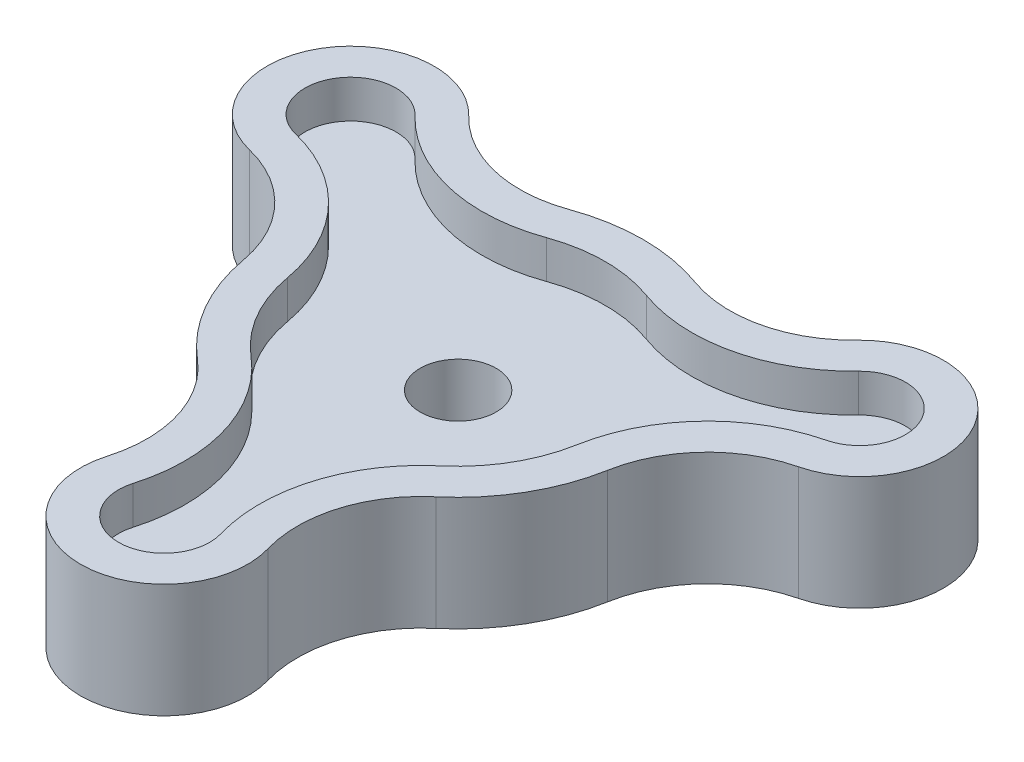
ISO-10303-21;
HEADER;
FILE_DESCRIPTION(('STEP AP214'),'2;1');
FILE_NAME('part.step','',(''),(''),'','','');
FILE_SCHEMA(('AUTOMOTIVE_DESIGN { 1 0 10303 214 1 1 1 1 }'));
ENDSEC;
DATA;
#1=APPLICATION_CONTEXT('core data for automotive mechanical design processes');
#2=APPLICATION_PROTOCOL_DEFINITION('international standard','automotive_design',2000,#1);
#3=PRODUCT_CONTEXT('',#1,'mechanical');
#4=PRODUCT('Part','Part','',(#3));
#5=PRODUCT_RELATED_PRODUCT_CATEGORY('part','',(#4));
#6=PRODUCT_DEFINITION_FORMATION('','',#4);
#7=PRODUCT_DEFINITION_CONTEXT('part definition',#1,'design');
#8=PRODUCT_DEFINITION('design','',#6,#7);
#9=PRODUCT_DEFINITION_SHAPE('','',#8);
#10=(LENGTH_UNIT() NAMED_UNIT(*) SI_UNIT(.MILLI.,.METRE.));
#11=(NAMED_UNIT(*) PLANE_ANGLE_UNIT() SI_UNIT($,.RADIAN.));
#12=(NAMED_UNIT(*) SI_UNIT($,.STERADIAN.) SOLID_ANGLE_UNIT());
#13=UNCERTAINTY_MEASURE_WITH_UNIT(LENGTH_MEASURE(1.E-05),#10,'distance_accuracy_value','');
#14=(GEOMETRIC_REPRESENTATION_CONTEXT(3) GLOBAL_UNCERTAINTY_ASSIGNED_CONTEXT((#13)) GLOBAL_UNIT_ASSIGNED_CONTEXT((#10,
#11,#12)) REPRESENTATION_CONTEXT('',''));
#15=CARTESIAN_POINT('',(0.,0.,0.));
#16=DIRECTION('',(0.,0.,1.));
#17=DIRECTION('',(1.,0.,0.));
#18=AXIS2_PLACEMENT_3D('',#15,#16,#17);
#19=CARTESIAN_POINT('',(0.,9.525,0.));
#20=DIRECTION('',(0.,1.,0.));
#21=DIRECTION('',(0.,0.,1.));
#22=AXIS2_PLACEMENT_3D('',#19,#20,#21);
#23=PLANE('',#22);
#24=CARTESIAN_POINT('',(28.575,9.525,46.9975254020045));
#25=DIRECTION('',(0.,1.,0.));
#26=DIRECTION('',(0.,0.,1.));
#27=AXIS2_PLACEMENT_3D('',#24,#25,#26);
#28=CIRCLE('',#27,3.81);
#29=CARTESIAN_POINT('',(24.9172400250551,9.525,45.9312740406028));
#30=VERTEX_POINT('',#29);
#31=CARTESIAN_POINT('',(32.2327599749449,9.525,45.9312740406028));
#32=VERTEX_POINT('',#31);
#33=EDGE_CURVE('E295',#30,#32,#28,.T.);
#34=ORIENTED_EDGE('',*,*,#33,.F.);
#35=CARTESIAN_POINT('',(11.9468231539004,9.525,42.1503467130723));
#36=DIRECTION('',(0.,1.,0.));
#37=DIRECTION('',(0.,0.,1.));
#38=AXIS2_PLACEMENT_3D('',#35,#36,#37);
#39=CIRCLE('',#38,13.51026);
#40=CARTESIAN_POINT('',(20.6569458181399,9.525,31.8226708640973));
#41=VERTEX_POINT('',#40);
#42=EDGE_CURVE('E247',#30,#41,#39,.T.);
#43=ORIENTED_EDGE('',*,*,#42,.T.);
#44=CARTESIAN_POINT('',(28.575,9.525,22.4341581993318));
#45=DIRECTION('',(0.,1.,0.));
#46=DIRECTION('',(0.,0.,1.));
#47=AXIS2_PLACEMENT_3D('',#44,#45,#46);
#48=CIRCLE('',#47,12.2816836013363);
#49=CARTESIAN_POINT('',(16.4852824376311,9.525,24.5971379369816));
#50=VERTEX_POINT('',#49);
#51=EDGE_CURVE('E269',#50,#41,#48,.T.);
#52=ORIENTED_EDGE('',*,*,#51,.F.);
#53=CARTESIAN_POINT('',(3.18619145824801,9.525,26.976487509804));
#54=DIRECTION('',(0.,1.,0.));
#55=DIRECTION('',(0.,0.,1.));
#56=AXIS2_PLACEMENT_3D('',#53,#54,#55);
#57=CIRCLE('',#56,13.51026);
#58=CARTESIAN_POINT('',(6.39702077832116,9.525,13.8533133379446));
#59=VERTEX_POINT('',#58);
#60=EDGE_CURVE('E320',#50,#59,#57,.T.);
#61=ORIENTED_EDGE('',*,*,#60,.T.);
#62=CARTESIAN_POINT('',(7.3025,9.525,10.1524745979955));
#63=DIRECTION('',(0.,1.,0.));
#64=DIRECTION('',(0.,0.,1.));
#65=AXIS2_PLACEMENT_3D('',#62,#63,#64);
#66=CIRCLE('',#65,3.81);
#67=CARTESIAN_POINT('',(10.0547807532661,9.525,7.51788721944815));
#68=VERTEX_POINT('',#67);
#69=EDGE_CURVE('E317',#68,#59,#66,.T.);
#70=ORIENTED_EDGE('',*,*,#69,.F.);
#71=CARTESIAN_POINT('',(19.8143683043476,9.525,-1.82435962488083));
#72=DIRECTION('',(0.,1.,0.));
#73=DIRECTION('',(0.,0.,1.));
#74=AXIS2_PLACEMENT_3D('',#71,#72,#73);
#75=CIRCLE('',#74,13.51026);
#76=CARTESIAN_POINT('',(24.4033366194913,9.525,10.8826657969167));
#77=VERTEX_POINT('',#76);
#78=EDGE_CURVE('E314',#68,#77,#75,.T.);
#79=ORIENTED_EDGE('',*,*,#78,.T.);
#80=CARTESIAN_POINT('',(32.7466633805087,9.525,10.8826657969166));
#81=VERTEX_POINT('',#80);
#82=EDGE_CURVE('E305',#81,#77,#48,.T.);
#83=ORIENTED_EDGE('',*,*,#82,.F.);
#84=CARTESIAN_POINT('',(37.3356316956524,9.525,-1.82435962488083));
#85=DIRECTION('',(0.,1.,0.));
#86=DIRECTION('',(0.,0.,1.));
#87=AXIS2_PLACEMENT_3D('',#84,#85,#86);
#88=CIRCLE('',#87,13.51026);
#89=CARTESIAN_POINT('',(47.0952192467339,9.525,7.51788721944815));
#90=VERTEX_POINT('',#89);
#91=EDGE_CURVE('E311',#81,#90,#88,.T.);
#92=ORIENTED_EDGE('',*,*,#91,.T.);
#93=CARTESIAN_POINT('',(49.8475,9.525,10.1524745979955));
#94=DIRECTION('',(0.,1.,0.));
#95=DIRECTION('',(0.,0.,1.));
#96=AXIS2_PLACEMENT_3D('',#93,#94,#95);
#97=CIRCLE('',#96,3.81);
#98=CARTESIAN_POINT('',(50.7529792216788,9.525,13.8533133379446));
#99=VERTEX_POINT('',#98);
#100=EDGE_CURVE('E308',#99,#90,#97,.T.);
#101=ORIENTED_EDGE('',*,*,#100,.F.);
#102=CARTESIAN_POINT('',(53.963808541752,9.525,26.976487509804));
#103=DIRECTION('',(0.,1.,0.));
#104=DIRECTION('',(0.,0.,1.));
#105=AXIS2_PLACEMENT_3D('',#102,#103,#104);
#106=CIRCLE('',#105,13.51026);
#107=CARTESIAN_POINT('',(40.6647175623689,9.525,24.5971379369816));
#108=VERTEX_POINT('',#107);
#109=EDGE_CURVE('E304',#99,#108,#106,.T.);
#110=ORIENTED_EDGE('',*,*,#109,.T.);
#111=CARTESIAN_POINT('',(36.4930541818601,9.525,31.8226708640973));
#112=VERTEX_POINT('',#111);
#113=EDGE_CURVE('E301',#112,#108,#48,.T.);
#114=ORIENTED_EDGE('',*,*,#113,.F.);
#115=CARTESIAN_POINT('',(45.2031768460996,9.525,42.1503467130723));
#116=DIRECTION('',(0.,1.,0.));
#117=DIRECTION('',(0.,0.,1.));
#118=AXIS2_PLACEMENT_3D('',#115,#116,#117);
#119=CIRCLE('',#118,13.51026);
#120=EDGE_CURVE('E298',#112,#32,#119,.T.);
#121=ORIENTED_EDGE('',*,*,#120,.T.);
#122=EDGE_LOOP('',(#34,#43,#52,#61,#70,#79,#83,#92,#101,#110,#114,#121));
#123=FACE_BOUND('',#122,.T.);
#124=CARTESIAN_POINT('',(19.8143683043476,9.525,-1.82435962488083));
#125=DIRECTION('',(0.,1.,0.));
#126=DIRECTION('',(0.,0.,1.));
#127=AXIS2_PLACEMENT_3D('',#124,#125,#126);
#128=CIRCLE('',#127,10.33526);
#129=CARTESIAN_POINT('',(12.3483480476545,9.525,5.32239773732534));
#130=VERTEX_POINT('',#129);
#131=CARTESIAN_POINT('',(23.3248988691755,9.525,7.89643120822576));
#132=VERTEX_POINT('',#131);
#133=EDGE_CURVE('E211',#130,#132,#128,.T.);
#134=ORIENTED_EDGE('',*,*,#133,.F.);
#135=CARTESIAN_POINT('',(7.3025,9.525,10.1524745979955));
#136=DIRECTION('',(0.,1.,0.));
#137=DIRECTION('',(0.,0.,1.));
#138=AXIS2_PLACEMENT_3D('',#135,#136,#137);
#139=CIRCLE('',#138,6.985);
#140=CARTESIAN_POINT('',(5.64245476025546,9.525,16.9373456212355));
#141=VERTEX_POINT('',#140);
#142=EDGE_CURVE('E54',#130,#141,#139,.T.);
#143=ORIENTED_EDGE('',*,*,#142,.T.);
#144=CARTESIAN_POINT('',(3.18619145824801,9.525,26.976487509804));
#145=DIRECTION('',(0.,1.,0.));
#146=DIRECTION('',(0.,0.,1.));
#147=AXIS2_PLACEMENT_3D('',#144,#145,#146);
#148=CIRCLE('',#147,10.33526);
#149=CARTESIAN_POINT('',(13.3599085470072,9.525,25.1563007431534));
#150=VERTEX_POINT('',#149);
#151=EDGE_CURVE('E242',#150,#141,#148,.T.);
#152=ORIENTED_EDGE('',*,*,#151,.F.);
#153=CARTESIAN_POINT('',(28.575,9.525,22.4341581993318));
#154=DIRECTION('',(0.,1.,0.));
#155=DIRECTION('',(0.,0.,1.));
#156=AXIS2_PLACEMENT_3D('',#153,#154,#155);
#157=CIRCLE('',#156,15.4566836013363);
#158=CARTESIAN_POINT('',(18.6100096778317,9.525,34.2497426466163));
#159=VERTEX_POINT('',#158);
#160=EDGE_CURVE('E239',#150,#159,#157,.T.);
#161=ORIENTED_EDGE('',*,*,#160,.T.);
#162=CARTESIAN_POINT('',(11.9468231539004,9.525,42.1503467130723));
#163=DIRECTION('',(0.,1.,0.));
#164=DIRECTION('',(0.,0.,1.));
#165=AXIS2_PLACEMENT_3D('',#162,#163,#164);
#166=CIRCLE('',#165,10.33526);
#167=CARTESIAN_POINT('',(21.869106712601,9.525,45.0427312394347));
#168=VERTEX_POINT('',#167);
#169=EDGE_CURVE('E236',#168,#159,#166,.T.);
#170=ORIENTED_EDGE('',*,*,#169,.F.);
#171=CARTESIAN_POINT('',(28.575,9.525,46.9975254020045));
#172=DIRECTION('',(0.,1.,0.));
#173=DIRECTION('',(0.,0.,1.));
#174=AXIS2_PLACEMENT_3D('',#171,#172,#173);
#175=CIRCLE('',#174,6.985);
#176=CARTESIAN_POINT('',(35.280893287399,9.525,45.0427312394347));
#177=VERTEX_POINT('',#176);
#178=EDGE_CURVE('E233',#168,#177,#175,.T.);
#179=ORIENTED_EDGE('',*,*,#178,.T.);
#180=CARTESIAN_POINT('',(45.2031768460996,9.525,42.1503467130723));
#181=DIRECTION('',(0.,1.,0.));
#182=DIRECTION('',(0.,0.,1.));
#183=AXIS2_PLACEMENT_3D('',#180,#181,#182);
#184=CIRCLE('',#183,10.33526);
#185=CARTESIAN_POINT('',(38.5399903221683,9.525,34.2497426466163));
#186=VERTEX_POINT('',#185);
#187=EDGE_CURVE('E230',#186,#177,#184,.T.);
#188=ORIENTED_EDGE('',*,*,#187,.F.);
#189=CARTESIAN_POINT('',(28.575,9.525,22.4341581993318));
#190=DIRECTION('',(0.,1.,0.));
#191=DIRECTION('',(0.,0.,1.));
#192=AXIS2_PLACEMENT_3D('',#189,#190,#191);
#193=CIRCLE('',#192,15.4566836013363);
#194=CARTESIAN_POINT('',(43.7900914529928,9.525,25.1563007431534));
#195=VERTEX_POINT('',#194);
#196=EDGE_CURVE('E227',#186,#195,#193,.T.);
#197=ORIENTED_EDGE('',*,*,#196,.T.);
#198=CARTESIAN_POINT('',(53.963808541752,9.525,26.976487509804));
#199=DIRECTION('',(0.,1.,0.));
#200=DIRECTION('',(0.,0.,1.));
#201=AXIS2_PLACEMENT_3D('',#198,#199,#200);
#202=CIRCLE('',#201,10.33526);
#203=CARTESIAN_POINT('',(51.5075452397445,9.525,16.9373456212355));
#204=VERTEX_POINT('',#203);
#205=EDGE_CURVE('E224',#204,#195,#202,.T.);
#206=ORIENTED_EDGE('',*,*,#205,.F.);
#207=CARTESIAN_POINT('',(49.8475,9.525,10.1524745979955));
#208=DIRECTION('',(0.,1.,0.));
#209=DIRECTION('',(0.,0.,1.));
#210=AXIS2_PLACEMENT_3D('',#207,#208,#209);
#211=CIRCLE('',#210,6.985);
#212=CARTESIAN_POINT('',(44.8016519523455,9.525,5.32239773732534));
#213=VERTEX_POINT('',#212);
#214=EDGE_CURVE('E219',#204,#213,#211,.T.);
#215=ORIENTED_EDGE('',*,*,#214,.T.);
#216=CARTESIAN_POINT('',(37.3356316956524,9.525,-1.82435962488083));
#217=DIRECTION('',(0.,1.,0.));
#218=DIRECTION('',(0.,0.,1.));
#219=AXIS2_PLACEMENT_3D('',#216,#217,#218);
#220=CIRCLE('',#219,10.33526);
#221=CARTESIAN_POINT('',(33.8251011308245,9.525,7.89643120822576));
#222=VERTEX_POINT('',#221);
#223=EDGE_CURVE('E217',#222,#213,#220,.T.);
#224=ORIENTED_EDGE('',*,*,#223,.F.);
#225=CARTESIAN_POINT('',(28.575,9.525,22.4341581993318));
#226=DIRECTION('',(0.,1.,0.));
#227=DIRECTION('',(0.,0.,1.));
#228=AXIS2_PLACEMENT_3D('',#225,#226,#227);
#229=CIRCLE('',#228,15.4566836013363);
#230=EDGE_CURVE('E202',#222,#132,#229,.T.);
#231=ORIENTED_EDGE('',*,*,#230,.T.);
#232=EDGE_LOOP('',(#134,#143,#152,#161,#170,#179,#188,#197,#206,#215,#224,#231));
#233=FACE_BOUND('',#232,.T.);
#234=ADVANCED_FACE('F39',(#123,#233),#23,.T.);
#235=CARTESIAN_POINT('',(11.9468231539004,6.35,42.1503467130723));
#236=DIRECTION('',(0.,1.,0.));
#237=DIRECTION('',(0.,0.,1.));
#238=AXIS2_PLACEMENT_3D('',#235,#236,#237);
#239=CYLINDRICAL_SURFACE('',#238,13.51026);
#240=ORIENTED_EDGE('',*,*,#42,.F.);
#241=DIRECTION('',(0.,1.,0.));
#242=VECTOR('',#241,1.);
#243=CARTESIAN_POINT('',(24.9172400250551,6.35,45.9312740406028));
#244=LINE('',#243,#242);
#245=CARTESIAN_POINT('',(24.9172400250551,6.35,45.9312740406028));
#246=VERTEX_POINT('',#245);
#247=EDGE_CURVE('E346',#246,#30,#244,.T.);
#248=ORIENTED_EDGE('',*,*,#247,.F.);
#249=CARTESIAN_POINT('',(11.9468231539004,6.35,42.1503467130723));
#250=DIRECTION('',(0.,1.,0.));
#251=DIRECTION('',(0.,0.,1.));
#252=AXIS2_PLACEMENT_3D('',#249,#250,#251);
#253=CIRCLE('',#252,13.51026);
#254=CARTESIAN_POINT('',(20.6569458181399,6.35,31.8226708640973));
#255=VERTEX_POINT('',#254);
#256=EDGE_CURVE('E266',#246,#255,#253,.T.);
#257=ORIENTED_EDGE('',*,*,#256,.T.);
#258=DIRECTION('',(0.,1.,0.));
#259=VECTOR('',#258,1.);
#260=CARTESIAN_POINT('',(20.6569458181399,6.35,31.8226708640973));
#261=LINE('',#260,#259);
#262=EDGE_CURVE('E323',#255,#41,#261,.T.);
#263=ORIENTED_EDGE('',*,*,#262,.T.);
#264=EDGE_LOOP('',(#240,#248,#257,#263));
#265=FACE_BOUND('',#264,.T.);
#266=ADVANCED_FACE('F455',(#265),#239,.T.);
#267=CARTESIAN_POINT('',(28.575,6.35,22.4341581993318));
#268=DIRECTION('',(0.,1.,0.));
#269=DIRECTION('',(0.,0.,1.));
#270=AXIS2_PLACEMENT_3D('',#267,#268,#269);
#271=CYLINDRICAL_SURFACE('',#270,12.2816836013363);
#272=ORIENTED_EDGE('',*,*,#51,.T.);
#273=ORIENTED_EDGE('',*,*,#262,.F.);
#274=CARTESIAN_POINT('',(28.575,6.35,22.4341581993318));
#275=DIRECTION('',(0.,1.,0.));
#276=DIRECTION('',(0.,0.,1.));
#277=AXIS2_PLACEMENT_3D('',#274,#275,#276);
#278=CIRCLE('',#277,12.2816836013363);
#279=CARTESIAN_POINT('',(16.4852824376311,6.35,24.5971379369816));
#280=VERTEX_POINT('',#279);
#281=EDGE_CURVE('E278',#280,#255,#278,.T.);
#282=ORIENTED_EDGE('',*,*,#281,.F.);
#283=DIRECTION('',(0.,1.,0.));
#284=VECTOR('',#283,1.);
#285=CARTESIAN_POINT('',(16.4852824376311,6.35,24.5971379369816));
#286=LINE('',#285,#284);
#287=EDGE_CURVE('E326',#280,#50,#286,.T.);
#288=ORIENTED_EDGE('',*,*,#287,.T.);
#289=EDGE_LOOP('',(#272,#273,#282,#288));
#290=FACE_BOUND('',#289,.T.);
#291=ADVANCED_FACE('F454',(#290),#271,.F.);
#292=CARTESIAN_POINT('',(3.18619145824801,6.35,26.976487509804));
#293=DIRECTION('',(0.,1.,0.));
#294=DIRECTION('',(0.,0.,1.));
#295=AXIS2_PLACEMENT_3D('',#292,#293,#294);
#296=CYLINDRICAL_SURFACE('',#295,13.51026);
#297=ORIENTED_EDGE('',*,*,#60,.F.);
#298=ORIENTED_EDGE('',*,*,#287,.F.);
#299=CARTESIAN_POINT('',(3.18619145824801,6.35,26.976487509804));
#300=DIRECTION('',(0.,1.,0.));
#301=DIRECTION('',(0.,0.,1.));
#302=AXIS2_PLACEMENT_3D('',#299,#300,#301);
#303=CIRCLE('',#302,13.51026);
#304=CARTESIAN_POINT('',(6.39702077832116,6.35,13.8533133379446));
#305=VERTEX_POINT('',#304);
#306=EDGE_CURVE('E291',#280,#305,#303,.T.);
#307=ORIENTED_EDGE('',*,*,#306,.T.);
#308=DIRECTION('',(0.,1.,0.));
#309=VECTOR('',#308,1.);
#310=CARTESIAN_POINT('',(6.39702077832116,6.35,13.8533133379446));
#311=LINE('',#310,#309);
#312=EDGE_CURVE('E328',#305,#59,#311,.T.);
#313=ORIENTED_EDGE('',*,*,#312,.T.);
#314=EDGE_LOOP('',(#297,#298,#307,#313));
#315=FACE_BOUND('',#314,.T.);
#316=ADVANCED_FACE('F450',(#315),#296,.T.);
#317=CARTESIAN_POINT('',(7.3025,6.35,10.1524745979955));
#318=DIRECTION('',(0.,1.,0.));
#319=DIRECTION('',(0.,0.,1.));
#320=AXIS2_PLACEMENT_3D('',#317,#318,#319);
#321=CYLINDRICAL_SURFACE('',#320,3.81);
#322=ORIENTED_EDGE('',*,*,#69,.T.);
#323=ORIENTED_EDGE('',*,*,#312,.F.);
#324=CARTESIAN_POINT('',(7.3025,6.35,10.1524745979955));
#325=DIRECTION('',(0.,1.,0.));
#326=DIRECTION('',(0.,0.,1.));
#327=AXIS2_PLACEMENT_3D('',#324,#325,#326);
#328=CIRCLE('',#327,3.81);
#329=CARTESIAN_POINT('',(10.0547807532661,6.35,7.51788721944815));
#330=VERTEX_POINT('',#329);
#331=EDGE_CURVE('E288',#330,#305,#328,.T.);
#332=ORIENTED_EDGE('',*,*,#331,.F.);
#333=DIRECTION('',(0.,1.,0.));
#334=VECTOR('',#333,1.);
#335=CARTESIAN_POINT('',(10.0547807532661,6.35,7.51788721944815));
#336=LINE('',#335,#334);
#337=EDGE_CURVE('E330',#330,#68,#336,.T.);
#338=ORIENTED_EDGE('',*,*,#337,.T.);
#339=EDGE_LOOP('',(#322,#323,#332,#338));
#340=FACE_BOUND('',#339,.T.);
#341=ADVANCED_FACE('F447',(#340),#321,.F.);
#342=CARTESIAN_POINT('',(19.8143683043476,6.35,-1.82435962488083));
#343=DIRECTION('',(0.,1.,0.));
#344=DIRECTION('',(0.,0.,1.));
#345=AXIS2_PLACEMENT_3D('',#342,#343,#344);
#346=CYLINDRICAL_SURFACE('',#345,13.51026);
#347=ORIENTED_EDGE('',*,*,#78,.F.);
#348=ORIENTED_EDGE('',*,*,#337,.F.);
#349=CARTESIAN_POINT('',(19.8143683043476,6.35,-1.82435962488083));
#350=DIRECTION('',(0.,1.,0.));
#351=DIRECTION('',(0.,0.,1.));
#352=AXIS2_PLACEMENT_3D('',#349,#350,#351);
#353=CIRCLE('',#352,13.51026);
#354=CARTESIAN_POINT('',(24.4033366194913,6.35,10.8826657969167));
#355=VERTEX_POINT('',#354);
#356=EDGE_CURVE('E286',#330,#355,#353,.T.);
#357=ORIENTED_EDGE('',*,*,#356,.T.);
#358=DIRECTION('',(0.,1.,0.));
#359=VECTOR('',#358,1.);
#360=CARTESIAN_POINT('',(24.4033366194913,6.35,10.8826657969167));
#361=LINE('',#360,#359);
#362=EDGE_CURVE('E332',#355,#77,#361,.T.);
#363=ORIENTED_EDGE('',*,*,#362,.T.);
#364=EDGE_LOOP('',(#347,#348,#357,#363));
#365=FACE_BOUND('',#364,.T.);
#366=ADVANCED_FACE('F442',(#365),#346,.T.);
#367=ORIENTED_EDGE('',*,*,#82,.T.);
#368=ORIENTED_EDGE('',*,*,#362,.F.);
#369=CARTESIAN_POINT('',(32.7466633805087,6.35,10.8826657969166));
#370=VERTEX_POINT('',#369);
#371=EDGE_CURVE('E279',#370,#355,#278,.T.);
#372=ORIENTED_EDGE('',*,*,#371,.F.);
#373=DIRECTION('',(0.,1.,0.));
#374=VECTOR('',#373,1.);
#375=CARTESIAN_POINT('',(32.7466633805087,6.35,10.8826657969166));
#376=LINE('',#375,#374);
#377=EDGE_CURVE('E334',#370,#81,#376,.T.);
#378=ORIENTED_EDGE('',*,*,#377,.T.);
#379=EDGE_LOOP('',(#367,#368,#372,#378));
#380=FACE_BOUND('',#379,.T.);
#381=ADVANCED_FACE('F439',(#380),#271,.F.);
#382=CARTESIAN_POINT('',(37.3356316956524,6.35,-1.82435962488083));
#383=DIRECTION('',(0.,1.,0.));
#384=DIRECTION('',(0.,0.,1.));
#385=AXIS2_PLACEMENT_3D('',#382,#383,#384);
#386=CYLINDRICAL_SURFACE('',#385,13.51026);
#387=ORIENTED_EDGE('',*,*,#91,.F.);
#388=ORIENTED_EDGE('',*,*,#377,.F.);
#389=CARTESIAN_POINT('',(37.3356316956524,6.35,-1.82435962488083));
#390=DIRECTION('',(0.,1.,0.));
#391=DIRECTION('',(0.,0.,1.));
#392=AXIS2_PLACEMENT_3D('',#389,#390,#391);
#393=CIRCLE('',#392,13.51026);
#394=CARTESIAN_POINT('',(47.0952192467339,6.35,7.51788721944815));
#395=VERTEX_POINT('',#394);
#396=EDGE_CURVE('E284',#370,#395,#393,.T.);
#397=ORIENTED_EDGE('',*,*,#396,.T.);
#398=DIRECTION('',(0.,1.,0.));
#399=VECTOR('',#398,1.);
#400=CARTESIAN_POINT('',(47.0952192467339,6.35,7.51788721944815));
#401=LINE('',#400,#399);
#402=EDGE_CURVE('E336',#395,#90,#401,.T.);
#403=ORIENTED_EDGE('',*,*,#402,.T.);
#404=EDGE_LOOP('',(#387,#388,#397,#403));
#405=FACE_BOUND('',#404,.T.);
#406=ADVANCED_FACE('F431',(#405),#386,.T.);
#407=CARTESIAN_POINT('',(49.8475,6.35,10.1524745979955));
#408=DIRECTION('',(0.,1.,0.));
#409=DIRECTION('',(0.,0.,1.));
#410=AXIS2_PLACEMENT_3D('',#407,#408,#409);
#411=CYLINDRICAL_SURFACE('',#410,3.81);
#412=ORIENTED_EDGE('',*,*,#100,.T.);
#413=ORIENTED_EDGE('',*,*,#402,.F.);
#414=CARTESIAN_POINT('',(49.8475,6.35,10.1524745979955));
#415=DIRECTION('',(0.,1.,0.));
#416=DIRECTION('',(0.,0.,1.));
#417=AXIS2_PLACEMENT_3D('',#414,#415,#416);
#418=CIRCLE('',#417,3.81);
#419=CARTESIAN_POINT('',(50.7529792216788,6.35,13.8533133379446));
#420=VERTEX_POINT('',#419);
#421=EDGE_CURVE('E281',#420,#395,#418,.T.);
#422=ORIENTED_EDGE('',*,*,#421,.F.);
#423=DIRECTION('',(0.,1.,0.));
#424=VECTOR('',#423,1.);
#425=CARTESIAN_POINT('',(50.7529792216788,6.35,13.8533133379446));
#426=LINE('',#425,#424);
#427=EDGE_CURVE('E338',#420,#99,#426,.T.);
#428=ORIENTED_EDGE('',*,*,#427,.T.);
#429=EDGE_LOOP('',(#412,#413,#422,#428));
#430=FACE_BOUND('',#429,.T.);
#431=ADVANCED_FACE('F428',(#430),#411,.F.);
#432=CARTESIAN_POINT('',(53.963808541752,6.35,26.976487509804));
#433=DIRECTION('',(0.,1.,0.));
#434=DIRECTION('',(0.,0.,1.));
#435=AXIS2_PLACEMENT_3D('',#432,#433,#434);
#436=CYLINDRICAL_SURFACE('',#435,13.51026);
#437=ORIENTED_EDGE('',*,*,#109,.F.);
#438=ORIENTED_EDGE('',*,*,#427,.F.);
#439=CARTESIAN_POINT('',(53.963808541752,6.35,26.976487509804));
#440=DIRECTION('',(0.,1.,0.));
#441=DIRECTION('',(0.,0.,1.));
#442=AXIS2_PLACEMENT_3D('',#439,#440,#441);
#443=CIRCLE('',#442,13.51026);
#444=CARTESIAN_POINT('',(40.6647175623689,6.35,24.5971379369816));
#445=VERTEX_POINT('',#444);
#446=EDGE_CURVE('E277',#420,#445,#443,.T.);
#447=ORIENTED_EDGE('',*,*,#446,.T.);
#448=DIRECTION('',(0.,1.,0.));
#449=VECTOR('',#448,1.);
#450=CARTESIAN_POINT('',(40.6647175623689,6.35,24.5971379369816));
#451=LINE('',#450,#449);
#452=EDGE_CURVE('E340',#445,#108,#451,.T.);
#453=ORIENTED_EDGE('',*,*,#452,.T.);
#454=EDGE_LOOP('',(#437,#438,#447,#453));
#455=FACE_BOUND('',#454,.T.);
#456=ADVANCED_FACE('F422',(#455),#436,.T.);
#457=ORIENTED_EDGE('',*,*,#113,.T.);
#458=ORIENTED_EDGE('',*,*,#452,.F.);
#459=CARTESIAN_POINT('',(36.4930541818601,6.35,31.8226708640973));
#460=VERTEX_POINT('',#459);
#461=EDGE_CURVE('E274',#460,#445,#278,.T.);
#462=ORIENTED_EDGE('',*,*,#461,.F.);
#463=DIRECTION('',(0.,1.,0.));
#464=VECTOR('',#463,1.);
#465=CARTESIAN_POINT('',(36.4930541818601,6.35,31.8226708640973));
#466=LINE('',#465,#464);
#467=EDGE_CURVE('E342',#460,#112,#466,.T.);
#468=ORIENTED_EDGE('',*,*,#467,.T.);
#469=EDGE_LOOP('',(#457,#458,#462,#468));
#470=FACE_BOUND('',#469,.T.);
#471=ADVANCED_FACE('F419',(#470),#271,.F.);
#472=CARTESIAN_POINT('',(45.2031768460996,6.35,42.1503467130723));
#473=DIRECTION('',(0.,1.,0.));
#474=DIRECTION('',(0.,0.,1.));
#475=AXIS2_PLACEMENT_3D('',#472,#473,#474);
#476=CYLINDRICAL_SURFACE('',#475,13.51026);
#477=ORIENTED_EDGE('',*,*,#120,.F.);
#478=ORIENTED_EDGE('',*,*,#467,.F.);
#479=CARTESIAN_POINT('',(45.2031768460996,6.35,42.1503467130723));
#480=DIRECTION('',(0.,1.,0.));
#481=DIRECTION('',(0.,0.,1.));
#482=AXIS2_PLACEMENT_3D('',#479,#480,#481);
#483=CIRCLE('',#482,13.51026);
#484=CARTESIAN_POINT('',(32.2327599749449,6.35,45.9312740406028));
#485=VERTEX_POINT('',#484);
#486=EDGE_CURVE('E272',#460,#485,#483,.T.);
#487=ORIENTED_EDGE('',*,*,#486,.T.);
#488=DIRECTION('',(0.,1.,0.));
#489=VECTOR('',#488,1.);
#490=CARTESIAN_POINT('',(32.2327599749449,6.35,45.9312740406028));
#491=LINE('',#490,#489);
#492=EDGE_CURVE('E344',#485,#32,#491,.T.);
#493=ORIENTED_EDGE('',*,*,#492,.T.);
#494=EDGE_LOOP('',(#477,#478,#487,#493));
#495=FACE_BOUND('',#494,.T.);
#496=ADVANCED_FACE('F413',(#495),#476,.T.);
#497=CARTESIAN_POINT('',(28.575,6.35,46.9975254020045));
#498=DIRECTION('',(0.,1.,0.));
#499=DIRECTION('',(0.,0.,1.));
#500=AXIS2_PLACEMENT_3D('',#497,#498,#499);
#501=CYLINDRICAL_SURFACE('',#500,3.81);
#502=ORIENTED_EDGE('',*,*,#33,.T.);
#503=ORIENTED_EDGE('',*,*,#492,.F.);
#504=CARTESIAN_POINT('',(28.575,6.35,46.9975254020045));
#505=DIRECTION('',(0.,1.,0.));
#506=DIRECTION('',(0.,0.,1.));
#507=AXIS2_PLACEMENT_3D('',#504,#505,#506);
#508=CIRCLE('',#507,3.81);
#509=EDGE_CURVE('E268',#246,#485,#508,.T.);
#510=ORIENTED_EDGE('',*,*,#509,.F.);
#511=ORIENTED_EDGE('',*,*,#247,.T.);
#512=EDGE_LOOP('',(#502,#503,#510,#511));
#513=FACE_BOUND('',#512,.T.);
#514=ADVANCED_FACE('F398',(#513),#501,.F.);
#515=CARTESIAN_POINT('',(0.,6.35,0.));
#516=DIRECTION('',(0.,1.,0.));
#517=DIRECTION('',(0.,0.,1.));
#518=AXIS2_PLACEMENT_3D('',#515,#516,#517);
#519=PLANE('',#518);
#520=CARTESIAN_POINT('',(28.575,6.35,22.4341581993318));
#521=DIRECTION('',(0.,1.,0.));
#522=DIRECTION('',(0.,0.,1.));
#523=AXIS2_PLACEMENT_3D('',#520,#521,#522);
#524=CIRCLE('',#523,3.175);
#525=CARTESIAN_POINT('',(28.575,6.35,25.6091581993318));
#526=VERTEX_POINT('',#525);
#527=EDGE_CURVE('E386',#526,#526,#524,.T.);
#528=ORIENTED_EDGE('',*,*,#527,.F.);
#529=EDGE_LOOP('',(#528));
#530=FACE_BOUND('',#529,.T.);
#531=ORIENTED_EDGE('',*,*,#256,.F.);
#532=ORIENTED_EDGE('',*,*,#509,.T.);
#533=ORIENTED_EDGE('',*,*,#486,.F.);
#534=ORIENTED_EDGE('',*,*,#461,.T.);
#535=ORIENTED_EDGE('',*,*,#446,.F.);
#536=ORIENTED_EDGE('',*,*,#421,.T.);
#537=ORIENTED_EDGE('',*,*,#396,.F.);
#538=ORIENTED_EDGE('',*,*,#371,.T.);
#539=ORIENTED_EDGE('',*,*,#356,.F.);
#540=ORIENTED_EDGE('',*,*,#331,.T.);
#541=ORIENTED_EDGE('',*,*,#306,.F.);
#542=ORIENTED_EDGE('',*,*,#281,.T.);
#543=EDGE_LOOP('',(#531,#532,#533,#534,#535,#536,#537,#538,#539,#540,#541,#542));
#544=FACE_BOUND('',#543,.T.);
#545=ADVANCED_FACE('F394',(#530,#544),#519,.T.);
#546=CARTESIAN_POINT('',(7.3025,-0.126999999999992,10.1524745979955));
#547=DIRECTION('',(0.,1.,0.));
#548=DIRECTION('',(0.,0.,1.));
#549=AXIS2_PLACEMENT_3D('',#546,#547,#548);
#550=CYLINDRICAL_SURFACE('',#549,6.985);
#551=CARTESIAN_POINT('',(7.3025,0.,10.1524745979955));
#552=DIRECTION('',(0.,1.,0.));
#553=DIRECTION('',(0.,0.,1.));
#554=AXIS2_PLACEMENT_3D('',#551,#552,#553);
#555=CIRCLE('',#554,6.985);
#556=CARTESIAN_POINT('',(12.3483480476545,0.,5.32239773732534));
#557=VERTEX_POINT('',#556);
#558=CARTESIAN_POINT('',(5.64245476025546,0.,16.9373456212355));
#559=VERTEX_POINT('',#558);
#560=EDGE_CURVE('E11',#557,#559,#555,.T.);
#561=ORIENTED_EDGE('',*,*,#560,.T.);
#562=DIRECTION('',(0.,1.,0.));
#563=VECTOR('',#562,1.);
#564=CARTESIAN_POINT('',(5.64245476025546,-0.126999999999992,16.9373456212355));
#565=LINE('',#564,#563);
#566=EDGE_CURVE('E245',#559,#141,#565,.T.);
#567=ORIENTED_EDGE('',*,*,#566,.T.);
#568=ORIENTED_EDGE('',*,*,#142,.F.);
#569=DIRECTION('',(0.,1.,0.));
#570=VECTOR('',#569,1.);
#571=CARTESIAN_POINT('',(12.3483480476545,-0.126999999999992,5.32239773732534));
#572=LINE('',#571,#570);
#573=EDGE_CURVE('E208',#557,#130,#572,.T.);
#574=ORIENTED_EDGE('',*,*,#573,.F.);
#575=EDGE_LOOP('',(#561,#567,#568,#574));
#576=FACE_BOUND('',#575,.T.);
#577=ADVANCED_FACE('F397',(#576),#550,.T.);
#578=CARTESIAN_POINT('',(3.18619145824801,-0.126999999999992,26.976487509804));
#579=DIRECTION('',(0.,1.,0.));
#580=DIRECTION('',(0.,0.,1.));
#581=AXIS2_PLACEMENT_3D('',#578,#579,#580);
#582=CYLINDRICAL_SURFACE('',#581,10.33526);
#583=DIRECTION('',(0.,1.,0.));
#584=VECTOR('',#583,1.);
#585=CARTESIAN_POINT('',(13.3599085470072,-0.126999999999992,25.1563007431534));
#586=LINE('',#585,#584);
#587=CARTESIAN_POINT('',(13.3599085470072,0.,25.1563007431534));
#588=VERTEX_POINT('',#587);
#589=EDGE_CURVE('E248',#588,#150,#586,.T.);
#590=ORIENTED_EDGE('',*,*,#589,.T.);
#591=ORIENTED_EDGE('',*,*,#151,.T.);
#592=ORIENTED_EDGE('',*,*,#566,.F.);
#593=CARTESIAN_POINT('',(3.18619145824801,0.,26.976487509804));
#594=DIRECTION('',(0.,1.,0.));
#595=DIRECTION('',(0.,0.,1.));
#596=AXIS2_PLACEMENT_3D('',#593,#594,#595);
#597=CIRCLE('',#596,10.33526);
#598=EDGE_CURVE('E47',#588,#559,#597,.T.);
#599=ORIENTED_EDGE('',*,*,#598,.F.);
#600=EDGE_LOOP('',(#590,#591,#592,#599));
#601=FACE_BOUND('',#600,.T.);
#602=ADVANCED_FACE('F377',(#601),#582,.F.);
#603=CARTESIAN_POINT('',(28.575,-0.126999999999992,22.4341581993318));
#604=DIRECTION('',(0.,1.,0.));
#605=DIRECTION('',(0.,0.,1.));
#606=AXIS2_PLACEMENT_3D('',#603,#604,#605);
#607=CYLINDRICAL_SURFACE('',#606,15.4566836013363);
#608=CARTESIAN_POINT('',(28.575,0.,22.4341581993318));
#609=DIRECTION('',(0.,1.,0.));
#610=DIRECTION('',(0.,0.,1.));
#611=AXIS2_PLACEMENT_3D('',#608,#609,#610);
#612=CIRCLE('',#611,15.4566836013363);
#613=CARTESIAN_POINT('',(18.6100096778317,0.,34.2497426466163));
#614=VERTEX_POINT('',#613);
#615=EDGE_CURVE('E369',#588,#614,#612,.T.);
#616=ORIENTED_EDGE('',*,*,#615,.T.);
#617=DIRECTION('',(0.,1.,0.));
#618=VECTOR('',#617,1.);
#619=CARTESIAN_POINT('',(18.6100096778317,-0.126999999999992,34.2497426466163));
#620=LINE('',#619,#618);
#621=EDGE_CURVE('E250',#614,#159,#620,.T.);
#622=ORIENTED_EDGE('',*,*,#621,.T.);
#623=ORIENTED_EDGE('',*,*,#160,.F.);
#624=ORIENTED_EDGE('',*,*,#589,.F.);
#625=EDGE_LOOP('',(#616,#622,#623,#624));
#626=FACE_BOUND('',#625,.T.);
#627=ADVANCED_FACE('F380',(#626),#607,.T.);
#628=CARTESIAN_POINT('',(11.9468231539004,-0.126999999999992,42.1503467130723));
#629=DIRECTION('',(0.,1.,0.));
#630=DIRECTION('',(0.,0.,1.));
#631=AXIS2_PLACEMENT_3D('',#628,#629,#630);
#632=CYLINDRICAL_SURFACE('',#631,10.33526);
#633=DIRECTION('',(0.,1.,0.));
#634=VECTOR('',#633,1.);
#635=CARTESIAN_POINT('',(21.869106712601,-0.126999999999992,45.0427312394347));
#636=LINE('',#635,#634);
#637=CARTESIAN_POINT('',(21.869106712601,0.,45.0427312394347));
#638=VERTEX_POINT('',#637);
#639=EDGE_CURVE('E252',#638,#168,#636,.T.);
#640=ORIENTED_EDGE('',*,*,#639,.T.);
#641=ORIENTED_EDGE('',*,*,#169,.T.);
#642=ORIENTED_EDGE('',*,*,#621,.F.);
#643=CARTESIAN_POINT('',(11.9468231539004,0.,42.1503467130723));
#644=DIRECTION('',(0.,1.,0.));
#645=DIRECTION('',(0.,0.,1.));
#646=AXIS2_PLACEMENT_3D('',#643,#644,#645);
#647=CIRCLE('',#646,10.33526);
#648=EDGE_CURVE('E366',#638,#614,#647,.T.);
#649=ORIENTED_EDGE('',*,*,#648,.F.);
#650=EDGE_LOOP('',(#640,#641,#642,#649));
#651=FACE_BOUND('',#650,.T.);
#652=ADVANCED_FACE('F510',(#651),#632,.F.);
#653=CARTESIAN_POINT('',(28.575,-0.126999999999992,46.9975254020045));
#654=DIRECTION('',(0.,1.,0.));
#655=DIRECTION('',(0.,0.,1.));
#656=AXIS2_PLACEMENT_3D('',#653,#654,#655);
#657=CYLINDRICAL_SURFACE('',#656,6.985);
#658=CARTESIAN_POINT('',(28.575,0.,46.9975254020045));
#659=DIRECTION('',(0.,1.,0.));
#660=DIRECTION('',(0.,0.,1.));
#661=AXIS2_PLACEMENT_3D('',#658,#659,#660);
#662=CIRCLE('',#661,6.985);
#663=CARTESIAN_POINT('',(35.280893287399,0.,45.0427312394347));
#664=VERTEX_POINT('',#663);
#665=EDGE_CURVE('E364',#638,#664,#662,.T.);
#666=ORIENTED_EDGE('',*,*,#665,.T.);
#667=DIRECTION('',(0.,1.,0.));
#668=VECTOR('',#667,1.);
#669=CARTESIAN_POINT('',(35.280893287399,-0.126999999999992,45.0427312394347));
#670=LINE('',#669,#668);
#671=EDGE_CURVE('E254',#664,#177,#670,.T.);
#672=ORIENTED_EDGE('',*,*,#671,.T.);
#673=ORIENTED_EDGE('',*,*,#178,.F.);
#674=ORIENTED_EDGE('',*,*,#639,.F.);
#675=EDGE_LOOP('',(#666,#672,#673,#674));
#676=FACE_BOUND('',#675,.T.);
#677=ADVANCED_FACE('F506',(#676),#657,.T.);
#678=CARTESIAN_POINT('',(45.2031768460996,-0.126999999999992,42.1503467130723));
#679=DIRECTION('',(0.,1.,0.));
#680=DIRECTION('',(0.,0.,1.));
#681=AXIS2_PLACEMENT_3D('',#678,#679,#680);
#682=CYLINDRICAL_SURFACE('',#681,10.33526);
#683=DIRECTION('',(0.,1.,0.));
#684=VECTOR('',#683,1.);
#685=CARTESIAN_POINT('',(38.5399903221683,-0.126999999999992,34.2497426466163));
#686=LINE('',#685,#684);
#687=CARTESIAN_POINT('',(38.5399903221683,0.,34.2497426466163));
#688=VERTEX_POINT('',#687);
#689=EDGE_CURVE('E256',#688,#186,#686,.T.);
#690=ORIENTED_EDGE('',*,*,#689,.T.);
#691=ORIENTED_EDGE('',*,*,#187,.T.);
#692=ORIENTED_EDGE('',*,*,#671,.F.);
#693=CARTESIAN_POINT('',(45.2031768460996,0.,42.1503467130723));
#694=DIRECTION('',(0.,1.,0.));
#695=DIRECTION('',(0.,0.,1.));
#696=AXIS2_PLACEMENT_3D('',#693,#694,#695);
#697=CIRCLE('',#696,10.33526);
#698=EDGE_CURVE('E361',#688,#664,#697,.T.);
#699=ORIENTED_EDGE('',*,*,#698,.F.);
#700=EDGE_LOOP('',(#690,#691,#692,#699));
#701=FACE_BOUND('',#700,.T.);
#702=ADVANCED_FACE('F502',(#701),#682,.F.);
#703=CARTESIAN_POINT('',(28.575,-0.126999999999992,22.4341581993318));
#704=DIRECTION('',(0.,1.,0.));
#705=DIRECTION('',(0.,0.,1.));
#706=AXIS2_PLACEMENT_3D('',#703,#704,#705);
#707=CYLINDRICAL_SURFACE('',#706,15.4566836013363);
#708=CARTESIAN_POINT('',(28.575,0.,22.4341581993318));
#709=DIRECTION('',(0.,1.,0.));
#710=DIRECTION('',(0.,0.,1.));
#711=AXIS2_PLACEMENT_3D('',#708,#709,#710);
#712=CIRCLE('',#711,15.4566836013363);
#713=CARTESIAN_POINT('',(43.7900914529928,0.,25.1563007431534));
#714=VERTEX_POINT('',#713);
#715=EDGE_CURVE('E359',#688,#714,#712,.T.);
#716=ORIENTED_EDGE('',*,*,#715,.T.);
#717=DIRECTION('',(0.,1.,0.));
#718=VECTOR('',#717,1.);
#719=CARTESIAN_POINT('',(43.7900914529928,-0.126999999999992,25.1563007431534));
#720=LINE('',#719,#718);
#721=EDGE_CURVE('E258',#714,#195,#720,.T.);
#722=ORIENTED_EDGE('',*,*,#721,.T.);
#723=ORIENTED_EDGE('',*,*,#196,.F.);
#724=ORIENTED_EDGE('',*,*,#689,.F.);
#725=EDGE_LOOP('',(#716,#722,#723,#724));
#726=FACE_BOUND('',#725,.T.);
#727=ADVANCED_FACE('F498',(#726),#707,.T.);
#728=CARTESIAN_POINT('',(53.963808541752,-0.126999999999992,26.976487509804));
#729=DIRECTION('',(0.,1.,0.));
#730=DIRECTION('',(0.,0.,1.));
#731=AXIS2_PLACEMENT_3D('',#728,#729,#730);
#732=CYLINDRICAL_SURFACE('',#731,10.33526);
#733=DIRECTION('',(0.,1.,0.));
#734=VECTOR('',#733,1.);
#735=CARTESIAN_POINT('',(51.5075452397445,-0.126999999999992,16.9373456212355));
#736=LINE('',#735,#734);
#737=CARTESIAN_POINT('',(51.5075452397445,0.,16.9373456212355));
#738=VERTEX_POINT('',#737);
#739=EDGE_CURVE('E260',#738,#204,#736,.T.);
#740=ORIENTED_EDGE('',*,*,#739,.T.);
#741=ORIENTED_EDGE('',*,*,#205,.T.);
#742=ORIENTED_EDGE('',*,*,#721,.F.);
#743=CARTESIAN_POINT('',(53.963808541752,0.,26.976487509804));
#744=DIRECTION('',(0.,1.,0.));
#745=DIRECTION('',(0.,0.,1.));
#746=AXIS2_PLACEMENT_3D('',#743,#744,#745);
#747=CIRCLE('',#746,10.33526);
#748=EDGE_CURVE('E356',#738,#714,#747,.T.);
#749=ORIENTED_EDGE('',*,*,#748,.F.);
#750=EDGE_LOOP('',(#740,#741,#742,#749));
#751=FACE_BOUND('',#750,.T.);
#752=ADVANCED_FACE('F494',(#751),#732,.F.);
#753=CARTESIAN_POINT('',(49.8475,-0.126999999999992,10.1524745979955));
#754=DIRECTION('',(0.,1.,0.));
#755=DIRECTION('',(0.,0.,1.));
#756=AXIS2_PLACEMENT_3D('',#753,#754,#755);
#757=CYLINDRICAL_SURFACE('',#756,6.985);
#758=CARTESIAN_POINT('',(49.8475,0.,10.1524745979955));
#759=DIRECTION('',(0.,1.,0.));
#760=DIRECTION('',(0.,0.,1.));
#761=AXIS2_PLACEMENT_3D('',#758,#759,#760);
#762=CIRCLE('',#761,6.985);
#763=CARTESIAN_POINT('',(44.8016519523455,0.,5.32239773732534));
#764=VERTEX_POINT('',#763);
#765=EDGE_CURVE('E354',#738,#764,#762,.T.);
#766=ORIENTED_EDGE('',*,*,#765,.T.);
#767=DIRECTION('',(0.,1.,0.));
#768=VECTOR('',#767,1.);
#769=CARTESIAN_POINT('',(44.8016519523455,-0.126999999999992,5.32239773732534));
#770=LINE('',#769,#768);
#771=EDGE_CURVE('E262',#764,#213,#770,.T.);
#772=ORIENTED_EDGE('',*,*,#771,.T.);
#773=ORIENTED_EDGE('',*,*,#214,.F.);
#774=ORIENTED_EDGE('',*,*,#739,.F.);
#775=EDGE_LOOP('',(#766,#772,#773,#774));
#776=FACE_BOUND('',#775,.T.);
#777=ADVANCED_FACE('F490',(#776),#757,.T.);
#778=CARTESIAN_POINT('',(37.3356316956524,-0.126999999999992,-1.82435962488083));
#779=DIRECTION('',(0.,1.,0.));
#780=DIRECTION('',(0.,0.,1.));
#781=AXIS2_PLACEMENT_3D('',#778,#779,#780);
#782=CYLINDRICAL_SURFACE('',#781,10.33526);
#783=DIRECTION('',(0.,1.,0.));
#784=VECTOR('',#783,1.);
#785=CARTESIAN_POINT('',(33.8251011308245,-0.126999999999992,7.89643120822576));
#786=LINE('',#785,#784);
#787=CARTESIAN_POINT('',(33.8251011308245,0.,7.89643120822576));
#788=VERTEX_POINT('',#787);
#789=EDGE_CURVE('E207',#788,#222,#786,.T.);
#790=ORIENTED_EDGE('',*,*,#789,.T.);
#791=ORIENTED_EDGE('',*,*,#223,.T.);
#792=ORIENTED_EDGE('',*,*,#771,.F.);
#793=CARTESIAN_POINT('',(37.3356316956524,0.,-1.82435962488083));
#794=DIRECTION('',(0.,1.,0.));
#795=DIRECTION('',(0.,0.,1.));
#796=AXIS2_PLACEMENT_3D('',#793,#794,#795);
#797=CIRCLE('',#796,10.33526);
#798=EDGE_CURVE('E351',#788,#764,#797,.T.);
#799=ORIENTED_EDGE('',*,*,#798,.F.);
#800=EDGE_LOOP('',(#790,#791,#792,#799));
#801=FACE_BOUND('',#800,.T.);
#802=ADVANCED_FACE('F487',(#801),#782,.F.);
#803=CARTESIAN_POINT('',(28.575,-0.126999999999992,22.4341581993318));
#804=DIRECTION('',(0.,1.,0.));
#805=DIRECTION('',(0.,0.,1.));
#806=AXIS2_PLACEMENT_3D('',#803,#804,#805);
#807=CYLINDRICAL_SURFACE('',#806,15.4566836013363);
#808=CARTESIAN_POINT('',(28.575,0.,22.4341581993318));
#809=DIRECTION('',(0.,1.,0.));
#810=DIRECTION('',(0.,0.,1.));
#811=AXIS2_PLACEMENT_3D('',#808,#809,#810);
#812=CIRCLE('',#811,15.4566836013363);
#813=CARTESIAN_POINT('',(23.3248988691755,0.,7.89643120822576));
#814=VERTEX_POINT('',#813);
#815=EDGE_CURVE('E205',#788,#814,#812,.T.);
#816=ORIENTED_EDGE('',*,*,#815,.T.);
#817=DIRECTION('',(0.,1.,0.));
#818=VECTOR('',#817,1.);
#819=CARTESIAN_POINT('',(23.3248988691755,-0.126999999999992,7.89643120822576));
#820=LINE('',#819,#818);
#821=EDGE_CURVE('E62',#814,#132,#820,.T.);
#822=ORIENTED_EDGE('',*,*,#821,.T.);
#823=ORIENTED_EDGE('',*,*,#230,.F.);
#824=ORIENTED_EDGE('',*,*,#789,.F.);
#825=EDGE_LOOP('',(#816,#822,#823,#824));
#826=FACE_BOUND('',#825,.T.);
#827=ADVANCED_FACE('F199',(#826),#807,.T.);
#828=CARTESIAN_POINT('',(19.8143683043476,-0.126999999999992,-1.82435962488083));
#829=DIRECTION('',(0.,1.,0.));
#830=DIRECTION('',(0.,0.,1.));
#831=AXIS2_PLACEMENT_3D('',#828,#829,#830);
#832=CYLINDRICAL_SURFACE('',#831,10.33526);
#833=ORIENTED_EDGE('',*,*,#573,.T.);
#834=ORIENTED_EDGE('',*,*,#133,.T.);
#835=ORIENTED_EDGE('',*,*,#821,.F.);
#836=CARTESIAN_POINT('',(19.8143683043476,0.,-1.82435962488083));
#837=DIRECTION('',(0.,1.,0.));
#838=DIRECTION('',(0.,0.,1.));
#839=AXIS2_PLACEMENT_3D('',#836,#837,#838);
#840=CIRCLE('',#839,10.33526);
#841=EDGE_CURVE('E325',#557,#814,#840,.T.);
#842=ORIENTED_EDGE('',*,*,#841,.F.);
#843=EDGE_LOOP('',(#833,#834,#835,#842));
#844=FACE_BOUND('',#843,.T.);
#845=ADVANCED_FACE('F212',(#844),#832,.F.);
#846=CARTESIAN_POINT('',(0.,0.,0.));
#847=DIRECTION('',(0.,1.,0.));
#848=DIRECTION('',(0.,0.,1.));
#849=AXIS2_PLACEMENT_3D('',#846,#847,#848);
#850=PLANE('',#849);
#851=CARTESIAN_POINT('',(28.575,0.,22.4341581993318));
#852=DIRECTION('',(0.,1.,0.));
#853=DIRECTION('',(0.,0.,1.));
#854=AXIS2_PLACEMENT_3D('',#851,#852,#853);
#855=CIRCLE('',#854,3.175);
#856=CARTESIAN_POINT('',(28.575,0.,25.6091581993318));
#857=VERTEX_POINT('',#856);
#858=EDGE_CURVE('E384',#857,#857,#855,.T.);
#859=ORIENTED_EDGE('',*,*,#858,.T.);
#860=EDGE_LOOP('',(#859));
#861=FACE_BOUND('',#860,.T.);
#862=ORIENTED_EDGE('',*,*,#560,.F.);
#863=ORIENTED_EDGE('',*,*,#841,.T.);
#864=ORIENTED_EDGE('',*,*,#815,.F.);
#865=ORIENTED_EDGE('',*,*,#798,.T.);
#866=ORIENTED_EDGE('',*,*,#765,.F.);
#867=ORIENTED_EDGE('',*,*,#748,.T.);
#868=ORIENTED_EDGE('',*,*,#715,.F.);
#869=ORIENTED_EDGE('',*,*,#698,.T.);
#870=ORIENTED_EDGE('',*,*,#665,.F.);
#871=ORIENTED_EDGE('',*,*,#648,.T.);
#872=ORIENTED_EDGE('',*,*,#615,.F.);
#873=ORIENTED_EDGE('',*,*,#598,.T.);
#874=EDGE_LOOP('',(#862,#863,#864,#865,#866,#867,#868,#869,#870,#871,#872,#873));
#875=FACE_BOUND('',#874,.T.);
#876=ADVANCED_FACE('F41',(#861,#875),#850,.F.);
#877=CARTESIAN_POINT('',(28.575,0.,22.4341581993318));
#878=DIRECTION('',(0.,1.,0.));
#879=DIRECTION('',(0.,0.,1.));
#880=AXIS2_PLACEMENT_3D('',#877,#878,#879);
#881=CYLINDRICAL_SURFACE('',#880,3.175);
#882=CARTESIAN_POINT('',(28.575,0.,25.6091581993318));
#883=CARTESIAN_POINT('',(28.575,0.0661458333333333,25.6091581993318));
#884=CARTESIAN_POINT('',(28.575,0.132291666666667,25.6091581993318));
#885=CARTESIAN_POINT('',(28.575,0.264583333333333,25.6091581993318));
#886=CARTESIAN_POINT('',(28.575,0.330729166666667,25.6091581993318));
#887=CARTESIAN_POINT('',(28.575,0.463020833333333,25.6091581993318));
#888=CARTESIAN_POINT('',(28.575,0.529166666666667,25.6091581993318));
#889=CARTESIAN_POINT('',(28.575,0.661458333333333,25.6091581993318));
#890=CARTESIAN_POINT('',(28.575,0.727604166666667,25.6091581993318));
#891=CARTESIAN_POINT('',(28.575,0.859895833333333,25.6091581993318));
#892=CARTESIAN_POINT('',(28.575,0.926041666666667,25.6091581993318));
#893=CARTESIAN_POINT('',(28.575,1.05833333333333,25.6091581993318));
#894=CARTESIAN_POINT('',(28.575,1.12447916666667,25.6091581993318));
#895=CARTESIAN_POINT('',(28.575,1.25677083333333,25.6091581993318));
#896=CARTESIAN_POINT('',(28.575,1.32291666666667,25.6091581993318));
#897=CARTESIAN_POINT('',(28.575,1.45520833333333,25.6091581993318));
#898=CARTESIAN_POINT('',(28.575,1.52135416666667,25.6091581993318));
#899=CARTESIAN_POINT('',(28.575,1.65364583333333,25.6091581993318));
#900=CARTESIAN_POINT('',(28.575,1.71979166666667,25.6091581993318));
#901=CARTESIAN_POINT('',(28.575,1.85208333333333,25.6091581993318));
#902=CARTESIAN_POINT('',(28.575,1.91822916666667,25.6091581993318));
#903=CARTESIAN_POINT('',(28.575,2.05052083333333,25.6091581993318));
#904=CARTESIAN_POINT('',(28.575,2.11666666666667,25.6091581993318));
#905=CARTESIAN_POINT('',(28.575,2.24895833333333,25.6091581993318));
#906=CARTESIAN_POINT('',(28.575,2.31510416666667,25.6091581993318));
#907=CARTESIAN_POINT('',(28.575,2.44739583333333,25.6091581993318));
#908=CARTESIAN_POINT('',(28.575,2.51354166666667,25.6091581993318));
#909=CARTESIAN_POINT('',(28.575,2.64583333333333,25.6091581993318));
#910=CARTESIAN_POINT('',(28.575,2.71197916666667,25.6091581993318));
#911=CARTESIAN_POINT('',(28.575,2.84427083333333,25.6091581993318));
#912=CARTESIAN_POINT('',(28.575,2.91041666666667,25.6091581993318));
#913=CARTESIAN_POINT('',(28.575,3.04270833333333,25.6091581993318));
#914=CARTESIAN_POINT('',(28.575,3.10885416666667,25.6091581993318));
#915=CARTESIAN_POINT('',(28.575,3.24114583333333,25.6091581993318));
#916=CARTESIAN_POINT('',(28.575,3.30729166666667,25.6091581993318));
#917=CARTESIAN_POINT('',(28.575,3.43958333333333,25.6091581993318));
#918=CARTESIAN_POINT('',(28.575,3.50572916666667,25.6091581993318));
#919=CARTESIAN_POINT('',(28.575,3.63802083333333,25.6091581993318));
#920=CARTESIAN_POINT('',(28.575,3.70416666666667,25.6091581993318));
#921=CARTESIAN_POINT('',(28.575,3.83645833333333,25.6091581993318));
#922=CARTESIAN_POINT('',(28.575,3.90260416666667,25.6091581993318));
#923=CARTESIAN_POINT('',(28.575,4.03489583333333,25.6091581993318));
#924=CARTESIAN_POINT('',(28.575,4.10104166666667,25.6091581993318));
#925=CARTESIAN_POINT('',(28.575,4.23333333333333,25.6091581993318));
#926=CARTESIAN_POINT('',(28.575,4.29947916666667,25.6091581993318));
#927=CARTESIAN_POINT('',(28.575,4.43177083333333,25.6091581993318));
#928=CARTESIAN_POINT('',(28.575,4.49791666666667,25.6091581993318));
#929=CARTESIAN_POINT('',(28.575,4.63020833333333,25.6091581993318));
#930=CARTESIAN_POINT('',(28.575,4.69635416666667,25.6091581993318));
#931=CARTESIAN_POINT('',(28.575,4.82864583333333,25.6091581993318));
#932=CARTESIAN_POINT('',(28.575,4.89479166666667,25.6091581993318));
#933=CARTESIAN_POINT('',(28.575,5.02708333333333,25.6091581993318));
#934=CARTESIAN_POINT('',(28.575,5.09322916666667,25.6091581993318));
#935=CARTESIAN_POINT('',(28.575,5.22552083333333,25.6091581993318));
#936=CARTESIAN_POINT('',(28.575,5.29166666666667,25.6091581993318));
#937=CARTESIAN_POINT('',(28.575,5.42395833333333,25.6091581993318));
#938=CARTESIAN_POINT('',(28.575,5.49010416666667,25.6091581993318));
#939=CARTESIAN_POINT('',(28.575,5.62239583333333,25.6091581993318));
#940=CARTESIAN_POINT('',(28.575,5.68854166666667,25.6091581993318));
#941=CARTESIAN_POINT('',(28.575,5.82083333333333,25.6091581993318));
#942=CARTESIAN_POINT('',(28.575,5.88697916666667,25.6091581993318));
#943=CARTESIAN_POINT('',(28.575,6.01927083333333,25.6091581993318));
#944=CARTESIAN_POINT('',(28.575,6.08541666666667,25.6091581993318));
#945=CARTESIAN_POINT('',(28.575,6.21770833333333,25.6091581993318));
#946=CARTESIAN_POINT('',(28.575,6.28385416666667,25.6091581993318));
#947=CARTESIAN_POINT('',(28.575,6.35,25.6091581993318));
#948=B_SPLINE_CURVE_WITH_KNOTS('',3,(#882,#883,#884,#885,#886,#887,#888,#889,#890,#891,#892,
#893,#894,#895,#896,#897,#898,#899,#900,#901,#902,#903,#904,#905,#906,#907,#908,#909,#910,#911,
#912,#913,#914,#915,#916,#917,#918,#919,#920,#921,#922,#923,#924,#925,#926,#927,#928,#929,#930,
#931,#932,#933,#934,#935,#936,#937,#938,#939,#940,#941,#942,#943,#944,#945,#946,#947),
.UNSPECIFIED.,.F.,.F.,(4,2,2,2,2,2,2,2,2,2,2,2,2,2,2,2,2,2,2,2,2,2,2,2,2,2,2,2,2,2,2,2,4),(0.,
0.1984375,0.396875,0.5953125,0.79375,0.9921875,1.190625,1.3890625,1.5875,1.7859375,1.984375,
2.1828125,2.38125,2.5796875,2.778125,2.9765625,3.175,3.3734375,3.571875,3.7703125,3.96875,
4.1671875,4.365625,4.5640625,4.7625,4.9609375,5.159375,5.3578125,5.55625,5.7546875,5.953125,
6.1515625,6.35),.UNSPECIFIED.);
#949=EDGE_CURVE('BSEAM392',#857,#526,#948,.T.);
#950=ORIENTED_EDGE('',*,*,#858,.F.);
#951=ORIENTED_EDGE('',*,*,#527,.T.);
#952=ORIENTED_EDGE('',*,*,#949,.T.);
#953=ORIENTED_EDGE('',*,*,#949,.F.);
#954=EDGE_LOOP('',(#950,#952,#951,#953));
#955=FACE_BOUND('',#954,.T.);
#956=ADVANCED_FACE('F392',(#955),#881,.F.);
#957=CLOSED_SHELL('',(#234,#266,#291,#316,#341,#366,#381,#406,#431,#456,#471,#496,#514,#545,
#577,#602,#627,#652,#677,#702,#727,#752,#777,#802,#827,#845,#876,#956));
#958=MANIFOLD_SOLID_BREP('B2',#957);
#959=ADVANCED_BREP_SHAPE_REPRESENTATION('',(#18,#958),#14);
#960=SHAPE_DEFINITION_REPRESENTATION(#9,#959);
ENDSEC;
END-ISO-10303-21;
